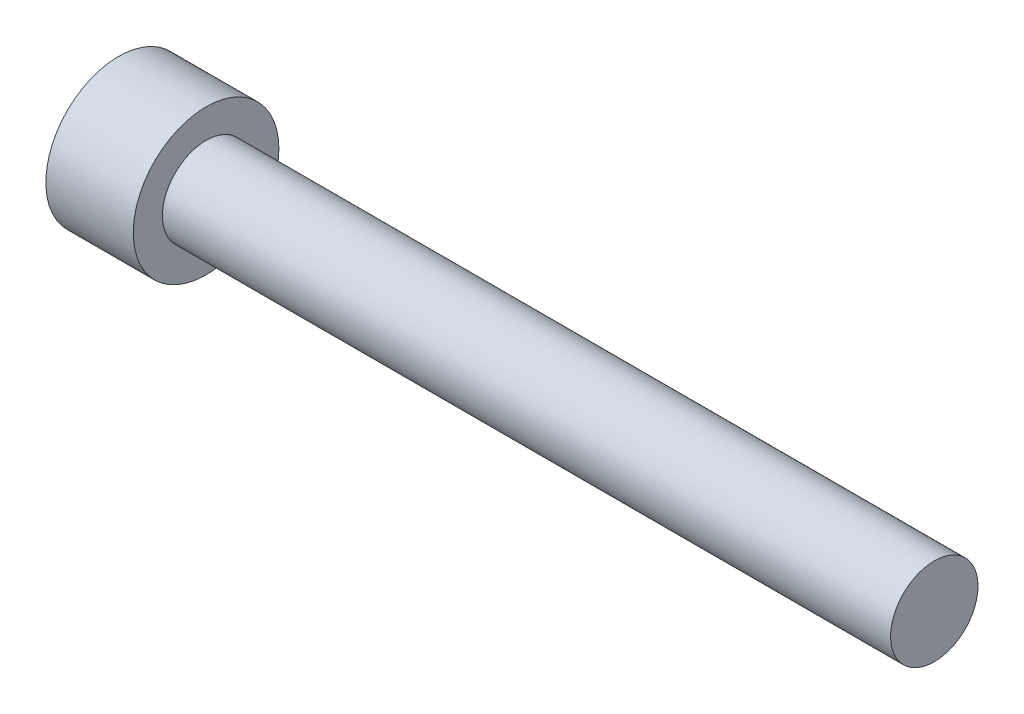
ISO-10303-21;
HEADER;
FILE_DESCRIPTION(('STEP AP214'),'2;1');
FILE_NAME('part.step','',(''),(''),'','','');
FILE_SCHEMA(('AUTOMOTIVE_DESIGN { 1 0 10303 214 1 1 1 1 }'));
ENDSEC;
DATA;
#1=APPLICATION_CONTEXT('core data for automotive mechanical design processes');
#2=APPLICATION_PROTOCOL_DEFINITION('international standard','automotive_design',2000,#1);
#3=PRODUCT_CONTEXT('',#1,'mechanical');
#4=PRODUCT('Part','Part','',(#3));
#5=PRODUCT_RELATED_PRODUCT_CATEGORY('part','',(#4));
#6=PRODUCT_DEFINITION_FORMATION('','',#4);
#7=PRODUCT_DEFINITION_CONTEXT('part definition',#1,'design');
#8=PRODUCT_DEFINITION('design','',#6,#7);
#9=PRODUCT_DEFINITION_SHAPE('','',#8);
#10=(LENGTH_UNIT() NAMED_UNIT(*) SI_UNIT(.MILLI.,.METRE.));
#11=(NAMED_UNIT(*) PLANE_ANGLE_UNIT() SI_UNIT($,.RADIAN.));
#12=(NAMED_UNIT(*) SI_UNIT($,.STERADIAN.) SOLID_ANGLE_UNIT());
#13=UNCERTAINTY_MEASURE_WITH_UNIT(LENGTH_MEASURE(1.E-05),#10,'distance_accuracy_value','');
#14=(GEOMETRIC_REPRESENTATION_CONTEXT(3) GLOBAL_UNCERTAINTY_ASSIGNED_CONTEXT((#13)) GLOBAL_UNIT_ASSIGNED_CONTEXT((#10,
#11,#12)) REPRESENTATION_CONTEXT('',''));
#15=CARTESIAN_POINT('',(0.,0.,0.));
#16=DIRECTION('',(0.,0.,1.));
#17=DIRECTION('',(1.,0.,0.));
#18=AXIS2_PLACEMENT_3D('',#15,#16,#17);
#19=CARTESIAN_POINT('',(0.,0.,0.));
#20=DIRECTION('',(-1.,0.,0.));
#21=DIRECTION('',(0.,0.,1.));
#22=AXIS2_PLACEMENT_3D('',#19,#20,#21);
#23=PLANE('',#22);
#24=CARTESIAN_POINT('',(0.,0.,0.));
#25=DIRECTION('',(1.,0.,0.));
#26=DIRECTION('',(0.,0.,-1.));
#27=AXIS2_PLACEMENT_3D('',#24,#25,#26);
#28=CIRCLE('',#27,2.5);
#29=CARTESIAN_POINT('',(0.,0.,-2.5));
#30=VERTEX_POINT('',#29);
#31=EDGE_CURVE('E10',#30,#30,#28,.T.);
#32=ORIENTED_EDGE('',*,*,#31,.F.);
#33=EDGE_LOOP('',(#32));
#34=FACE_BOUND('',#33,.T.);
#35=ADVANCED_FACE('F34',(#34),#23,.T.);
#36=CARTESIAN_POINT('',(28.,0.,0.));
#37=DIRECTION('',(1.,0.,0.));
#38=DIRECTION('',(0.,0.,-1.));
#39=AXIS2_PLACEMENT_3D('',#36,#37,#38);
#40=CYLINDRICAL_SURFACE('',#39,2.5);
#41=ORIENTED_EDGE('',*,*,#31,.T.);
#42=EDGE_LOOP('',(#41));
#43=FACE_BOUND('',#42,.T.);
#44=CARTESIAN_POINT('',(3.,0.,0.));
#45=DIRECTION('',(1.,0.,0.));
#46=DIRECTION('',(0.,0.,-1.));
#47=AXIS2_PLACEMENT_3D('',#44,#45,#46);
#48=CIRCLE('',#47,2.5);
#49=CARTESIAN_POINT('',(3.,0.,-2.5));
#50=VERTEX_POINT('',#49);
#51=EDGE_CURVE('E40',#50,#50,#48,.T.);
#52=ORIENTED_EDGE('',*,*,#51,.F.);
#53=EDGE_LOOP('',(#52));
#54=FACE_BOUND('',#53,.T.);
#55=ADVANCED_FACE('F66',(#43,#54),#40,.T.);
#56=CARTESIAN_POINT('',(3.,0.,-2.5));
#57=DIRECTION('',(1.,0.,0.));
#58=DIRECTION('',(0.,0.,-1.));
#59=AXIS2_PLACEMENT_3D('',#56,#57,#58);
#60=PLANE('',#59);
#61=ORIENTED_EDGE('',*,*,#51,.T.);
#62=EDGE_LOOP('',(#61));
#63=FACE_BOUND('',#62,.T.);
#64=CARTESIAN_POINT('',(3.,0.,0.));
#65=DIRECTION('',(1.,0.,0.));
#66=DIRECTION('',(0.,0.,-1.));
#67=AXIS2_PLACEMENT_3D('',#64,#65,#66);
#68=CIRCLE('',#67,1.5);
#69=CARTESIAN_POINT('',(3.,0.,-1.5));
#70=VERTEX_POINT('',#69);
#71=EDGE_CURVE('E44',#70,#70,#68,.T.);
#72=ORIENTED_EDGE('',*,*,#71,.F.);
#73=EDGE_LOOP('',(#72));
#74=FACE_BOUND('',#73,.T.);
#75=ADVANCED_FACE('F58',(#63,#74),#60,.T.);
#76=CARTESIAN_POINT('',(28.,0.,0.));
#77=DIRECTION('',(1.,0.,0.));
#78=DIRECTION('',(0.,0.,-1.));
#79=AXIS2_PLACEMENT_3D('',#76,#77,#78);
#80=CYLINDRICAL_SURFACE('',#79,1.5);
#81=ORIENTED_EDGE('',*,*,#71,.T.);
#82=EDGE_LOOP('',(#81));
#83=FACE_BOUND('',#82,.T.);
#84=CARTESIAN_POINT('',(28.,0.,0.));
#85=DIRECTION('',(1.,0.,0.));
#86=DIRECTION('',(0.,0.,-1.));
#87=AXIS2_PLACEMENT_3D('',#84,#85,#86);
#88=CIRCLE('',#87,1.5);
#89=CARTESIAN_POINT('',(28.,0.,-1.5));
#90=VERTEX_POINT('',#89);
#91=EDGE_CURVE('E48',#90,#90,#88,.T.);
#92=ORIENTED_EDGE('',*,*,#91,.F.);
#93=EDGE_LOOP('',(#92));
#94=FACE_BOUND('',#93,.T.);
#95=ADVANCED_FACE('F56',(#83,#94),#80,.T.);
#96=CARTESIAN_POINT('',(28.,0.,-1.5));
#97=DIRECTION('',(1.,0.,0.));
#98=DIRECTION('',(0.,0.,-1.));
#99=AXIS2_PLACEMENT_3D('',#96,#97,#98);
#100=PLANE('',#99);
#101=ORIENTED_EDGE('',*,*,#91,.T.);
#102=EDGE_LOOP('',(#101));
#103=FACE_BOUND('',#102,.T.);
#104=ADVANCED_FACE('F54',(#103),#100,.T.);
#105=CLOSED_SHELL('',(#35,#55,#75,#95,#104));
#106=MANIFOLD_SOLID_BREP('B2',#105);
#107=ADVANCED_BREP_SHAPE_REPRESENTATION('',(#18,#106),#14);
#108=SHAPE_DEFINITION_REPRESENTATION(#9,#107);
ENDSEC;
END-ISO-10303-21;
